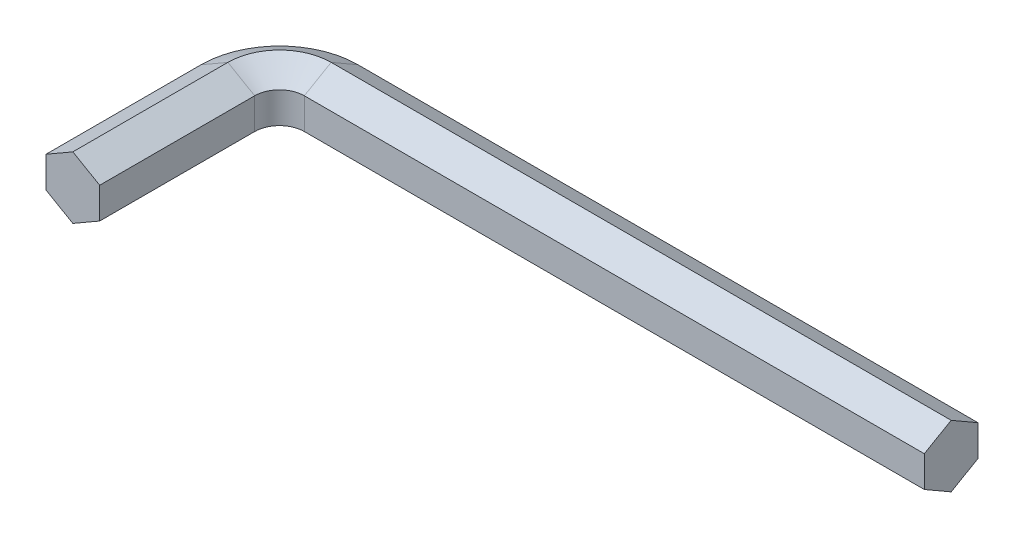
ISO-10303-21;
HEADER;
FILE_DESCRIPTION(('STEP AP214'),'2;1');
FILE_NAME('part.step','',(''),(''),'','','');
FILE_SCHEMA(('AUTOMOTIVE_DESIGN { 1 0 10303 214 1 1 1 1 }'));
ENDSEC;
DATA;
#1=APPLICATION_CONTEXT('core data for automotive mechanical design processes');
#2=APPLICATION_PROTOCOL_DEFINITION('international standard','automotive_design',2000,#1);
#3=PRODUCT_CONTEXT('',#1,'mechanical');
#4=PRODUCT('Part','Part','',(#3));
#5=PRODUCT_RELATED_PRODUCT_CATEGORY('part','',(#4));
#6=PRODUCT_DEFINITION_FORMATION('','',#4);
#7=PRODUCT_DEFINITION_CONTEXT('part definition',#1,'design');
#8=PRODUCT_DEFINITION('design','',#6,#7);
#9=PRODUCT_DEFINITION_SHAPE('','',#8);
#10=(LENGTH_UNIT() NAMED_UNIT(*) SI_UNIT(.MILLI.,.METRE.));
#11=(NAMED_UNIT(*) PLANE_ANGLE_UNIT() SI_UNIT($,.RADIAN.));
#12=(NAMED_UNIT(*) SI_UNIT($,.STERADIAN.) SOLID_ANGLE_UNIT());
#13=UNCERTAINTY_MEASURE_WITH_UNIT(LENGTH_MEASURE(1.E-05),#10,'distance_accuracy_value','');
#14=(GEOMETRIC_REPRESENTATION_CONTEXT(3) GLOBAL_UNCERTAINTY_ASSIGNED_CONTEXT((#13)) GLOBAL_UNIT_ASSIGNED_CONTEXT((#10,
#11,#12)) REPRESENTATION_CONTEXT('',''));
#15=CARTESIAN_POINT('',(0.,0.,0.));
#16=DIRECTION('',(0.,0.,1.));
#17=DIRECTION('',(1.,0.,0.));
#18=AXIS2_PLACEMENT_3D('',#15,#16,#17);
#19=CARTESIAN_POINT('',(-1.28205128205128,0.,11.7948717948718));
#20=DIRECTION('',(0.,0.,-1.));
#21=DIRECTION('',(-1.,0.,0.));
#22=AXIS2_PLACEMENT_3D('',#19,#20,#21);
#23=PLANE('',#22);
#24=DIRECTION('',(0.866025403784439,-0.5,0.));
#25=VECTOR('',#24,1.);
#26=CARTESIAN_POINT('',(-9.48717948717949,3.,11.7948717948718));
#27=LINE('',#26,#25);
#28=CARTESIAN_POINT('',(-9.48717948717949,3.,11.7948717948718));
#29=VERTEX_POINT('',#28);
#30=CARTESIAN_POINT('',(-6.88910327582617,1.5,11.7948717948718));
#31=VERTEX_POINT('',#30);
#32=EDGE_CURVE('E182',#29,#31,#27,.T.);
#33=ORIENTED_EDGE('',*,*,#32,.F.);
#34=DIRECTION('',(0.866025403784438,0.5,0.));
#35=VECTOR('',#34,1.);
#36=CARTESIAN_POINT('',(-12.0852556985328,1.5,11.7948717948718));
#37=LINE('',#36,#35);
#38=CARTESIAN_POINT('',(-12.0852556985328,1.5,11.7948717948718));
#39=VERTEX_POINT('',#38);
#40=EDGE_CURVE('E224',#39,#29,#37,.T.);
#41=ORIENTED_EDGE('',*,*,#40,.F.);
#42=DIRECTION('',(0.,1.,0.));
#43=VECTOR('',#42,1.);
#44=CARTESIAN_POINT('',(-12.0852556985328,-1.5,11.7948717948718));
#45=LINE('',#44,#43);
#46=CARTESIAN_POINT('',(-12.0852556985328,-1.5,11.7948717948718));
#47=VERTEX_POINT('',#46);
#48=EDGE_CURVE('E211',#47,#39,#45,.T.);
#49=ORIENTED_EDGE('',*,*,#48,.F.);
#50=DIRECTION('',(-0.866025403784439,0.5,0.));
#51=VECTOR('',#50,1.);
#52=CARTESIAN_POINT('',(-9.48717948717949,-3.,11.7948717948718));
#53=LINE('',#52,#51);
#54=CARTESIAN_POINT('',(-9.48717948717949,-3.,11.7948717948718));
#55=VERTEX_POINT('',#54);
#56=EDGE_CURVE('E134',#55,#47,#53,.T.);
#57=ORIENTED_EDGE('',*,*,#56,.F.);
#58=DIRECTION('',(-0.866025403784439,-0.5,0.));
#59=VECTOR('',#58,1.);
#60=CARTESIAN_POINT('',(-6.88910327582617,-1.5,11.7948717948718));
#61=LINE('',#60,#59);
#62=CARTESIAN_POINT('',(-6.88910327582617,-1.5,11.7948717948718));
#63=VERTEX_POINT('',#62);
#64=EDGE_CURVE('E138',#63,#55,#61,.T.);
#65=ORIENTED_EDGE('',*,*,#64,.F.);
#66=DIRECTION('',(0.,-1.,0.));
#67=VECTOR('',#66,1.);
#68=CARTESIAN_POINT('',(-6.88910327582617,1.5,11.7948717948718));
#69=LINE('',#68,#67);
#70=EDGE_CURVE('E143',#31,#63,#69,.T.);
#71=ORIENTED_EDGE('',*,*,#70,.F.);
#72=EDGE_LOOP('',(#33,#41,#49,#57,#65,#71));
#73=FACE_BOUND('',#72,.T.);
#74=ADVANCED_FACE('F33',(#73),#23,.F.);
#75=CARTESIAN_POINT('',(55.5128205128205,0.,0.));
#76=DIRECTION('',(1.,0.,0.));
#77=DIRECTION('',(0.,0.,-1.));
#78=AXIS2_PLACEMENT_3D('',#75,#76,#77);
#79=PLANE('',#78);
#80=DIRECTION('',(0.,-0.5,0.866025403784439));
#81=VECTOR('',#80,1.);
#82=CARTESIAN_POINT('',(55.5128205128205,3.,-8.2051282051282));
#83=LINE('',#82,#81);
#84=CARTESIAN_POINT('',(55.5128205128205,3.,-8.2051282051282));
#85=VERTEX_POINT('',#84);
#86=CARTESIAN_POINT('',(55.5128205128205,1.5,-5.60705199377489));
#87=VERTEX_POINT('',#86);
#88=EDGE_CURVE('E154',#85,#87,#83,.T.);
#89=ORIENTED_EDGE('',*,*,#88,.T.);
#90=DIRECTION('',(0.,-1.,0.));
#91=VECTOR('',#90,1.);
#92=CARTESIAN_POINT('',(55.5128205128205,1.5,-5.60705199377489));
#93=LINE('',#92,#91);
#94=CARTESIAN_POINT('',(55.5128205128205,-1.5,-5.60705199377489));
#95=VERTEX_POINT('',#94);
#96=EDGE_CURVE('E157',#87,#95,#93,.T.);
#97=ORIENTED_EDGE('',*,*,#96,.T.);
#98=DIRECTION('',(0.,-0.5,-0.866025403784439));
#99=VECTOR('',#98,1.);
#100=CARTESIAN_POINT('',(55.5128205128205,-1.5,-5.60705199377489));
#101=LINE('',#100,#99);
#102=CARTESIAN_POINT('',(55.5128205128205,-3.,-8.20512820512821));
#103=VERTEX_POINT('',#102);
#104=EDGE_CURVE('E197',#95,#103,#101,.T.);
#105=ORIENTED_EDGE('',*,*,#104,.T.);
#106=DIRECTION('',(0.,0.5,-0.866025403784439));
#107=VECTOR('',#106,1.);
#108=CARTESIAN_POINT('',(55.5128205128205,-3.,-8.20512820512821));
#109=LINE('',#108,#107);
#110=CARTESIAN_POINT('',(55.5128205128205,-1.5,-10.8032044164815));
#111=VERTEX_POINT('',#110);
#112=EDGE_CURVE('E52',#103,#111,#109,.T.);
#113=ORIENTED_EDGE('',*,*,#112,.T.);
#114=DIRECTION('',(0.,1.,0.));
#115=VECTOR('',#114,1.);
#116=CARTESIAN_POINT('',(55.5128205128205,-1.5,-10.8032044164815));
#117=LINE('',#116,#115);
#118=CARTESIAN_POINT('',(55.5128205128205,1.5,-10.8032044164815));
#119=VERTEX_POINT('',#118);
#120=EDGE_CURVE('E46',#111,#119,#117,.T.);
#121=ORIENTED_EDGE('',*,*,#120,.T.);
#122=DIRECTION('',(0.,0.5,0.866025403784438));
#123=VECTOR('',#122,1.);
#124=CARTESIAN_POINT('',(55.5128205128205,1.5,-10.8032044164815));
#125=LINE('',#124,#123);
#126=EDGE_CURVE('E11',#119,#85,#125,.T.);
#127=ORIENTED_EDGE('',*,*,#126,.T.);
#128=EDGE_LOOP('',(#89,#97,#105,#113,#121,#127));
#129=FACE_BOUND('',#128,.T.);
#130=ADVANCED_FACE('F156',(#129),#79,.T.);
#131=CARTESIAN_POINT('',(-9.48717948717949,3.,11.7948717948718));
#132=DIRECTION('',(0.5,0.866025403784439,0.));
#133=DIRECTION('',(-0.866025403784439,0.5,0.));
#134=AXIS2_PLACEMENT_3D('',#131,#132,#133);
#135=PLANE('',#134);
#136=DIRECTION('',(0.,0.,-1.));
#137=VECTOR('',#136,1.);
#138=CARTESIAN_POINT('',(-6.88910327582617,1.5,11.7948717948718));
#139=LINE('',#138,#137);
#140=CARTESIAN_POINT('',(-6.88910327582617,1.5,-3.20512820512822));
#141=VERTEX_POINT('',#140);
#142=EDGE_CURVE('E187',#31,#141,#139,.T.);
#143=ORIENTED_EDGE('',*,*,#142,.T.);
#144=DIRECTION('',(0.866025403784439,-0.5,0.));
#145=VECTOR('',#144,1.);
#146=CARTESIAN_POINT('',(-9.48717948717949,3.,-3.20512820512822));
#147=LINE('',#146,#145);
#148=CARTESIAN_POINT('',(-9.48717948717949,3.,-3.20512820512822));
#149=VERTEX_POINT('',#148);
#150=EDGE_CURVE('E256',#149,#141,#147,.T.);
#151=ORIENTED_EDGE('',*,*,#150,.F.);
#152=DIRECTION('',(0.,0.,-1.));
#153=VECTOR('',#152,1.);
#154=CARTESIAN_POINT('',(-9.48717948717949,3.,11.7948717948718));
#155=LINE('',#154,#153);
#156=EDGE_CURVE('E238',#29,#149,#155,.T.);
#157=ORIENTED_EDGE('',*,*,#156,.F.);
#158=ORIENTED_EDGE('',*,*,#32,.T.);
#159=EDGE_LOOP('',(#143,#151,#157,#158));
#160=FACE_BOUND('',#159,.T.);
#161=ADVANCED_FACE('F263',(#160),#135,.T.);
#162=CARTESIAN_POINT('',(-6.88910327582617,1.5,11.7948717948718));
#163=DIRECTION('',(1.,0.,0.));
#164=DIRECTION('',(0.,0.,-1.));
#165=AXIS2_PLACEMENT_3D('',#162,#163,#164);
#166=PLANE('',#165);
#167=DIRECTION('',(0.,0.,-1.));
#168=VECTOR('',#167,1.);
#169=CARTESIAN_POINT('',(-6.88910327582617,-1.5,11.7948717948718));
#170=LINE('',#169,#168);
#171=CARTESIAN_POINT('',(-6.88910327582617,-1.5,-3.20512820512822));
#172=VERTEX_POINT('',#171);
#173=EDGE_CURVE('E186',#63,#172,#170,.T.);
#174=ORIENTED_EDGE('',*,*,#173,.T.);
#175=DIRECTION('',(0.,-1.,0.));
#176=VECTOR('',#175,1.);
#177=CARTESIAN_POINT('',(-6.88910327582617,1.5,-3.20512820512822));
#178=LINE('',#177,#176);
#179=EDGE_CURVE('E183',#141,#172,#178,.T.);
#180=ORIENTED_EDGE('',*,*,#179,.F.);
#181=ORIENTED_EDGE('',*,*,#142,.F.);
#182=ORIENTED_EDGE('',*,*,#70,.T.);
#183=EDGE_LOOP('',(#174,#180,#181,#182));
#184=FACE_BOUND('',#183,.T.);
#185=ADVANCED_FACE('F266',(#184),#166,.T.);
#186=CARTESIAN_POINT('',(-6.88910327582617,-1.5,11.7948717948718));
#187=DIRECTION('',(0.5,-0.866025403784439,0.));
#188=DIRECTION('',(0.866025403784439,0.5,0.));
#189=AXIS2_PLACEMENT_3D('',#186,#187,#188);
#190=PLANE('',#189);
#191=DIRECTION('',(0.,0.,-1.));
#192=VECTOR('',#191,1.);
#193=CARTESIAN_POINT('',(-9.48717948717949,-3.,11.7948717948718));
#194=LINE('',#193,#192);
#195=CARTESIAN_POINT('',(-9.48717948717949,-3.,-3.20512820512822));
#196=VERTEX_POINT('',#195);
#197=EDGE_CURVE('E200',#55,#196,#194,.T.);
#198=ORIENTED_EDGE('',*,*,#197,.T.);
#199=DIRECTION('',(-0.866025403784439,-0.5,0.));
#200=VECTOR('',#199,1.);
#201=CARTESIAN_POINT('',(-6.88910327582617,-1.5,-3.20512820512822));
#202=LINE('',#201,#200);
#203=EDGE_CURVE('E190',#172,#196,#202,.T.);
#204=ORIENTED_EDGE('',*,*,#203,.F.);
#205=ORIENTED_EDGE('',*,*,#173,.F.);
#206=ORIENTED_EDGE('',*,*,#64,.T.);
#207=EDGE_LOOP('',(#198,#204,#205,#206));
#208=FACE_BOUND('',#207,.T.);
#209=ADVANCED_FACE('F320',(#208),#190,.T.);
#210=CARTESIAN_POINT('',(-9.48717948717949,-3.,11.7948717948718));
#211=DIRECTION('',(-0.5,-0.866025403784439,0.));
#212=DIRECTION('',(0.866025403784439,-0.5,0.));
#213=AXIS2_PLACEMENT_3D('',#210,#211,#212);
#214=PLANE('',#213);
#215=DIRECTION('',(0.,0.,-1.));
#216=VECTOR('',#215,1.);
#217=CARTESIAN_POINT('',(-12.0852556985328,-1.5,11.7948717948718));
#218=LINE('',#217,#216);
#219=CARTESIAN_POINT('',(-12.0852556985328,-1.5,-3.20512820512822));
#220=VERTEX_POINT('',#219);
#221=EDGE_CURVE('E213',#47,#220,#218,.T.);
#222=ORIENTED_EDGE('',*,*,#221,.T.);
#223=DIRECTION('',(-0.866025403784439,0.5,0.));
#224=VECTOR('',#223,1.);
#225=CARTESIAN_POINT('',(-9.48717948717949,-3.,-3.20512820512822));
#226=LINE('',#225,#224);
#227=EDGE_CURVE('E203',#196,#220,#226,.T.);
#228=ORIENTED_EDGE('',*,*,#227,.F.);
#229=ORIENTED_EDGE('',*,*,#197,.F.);
#230=ORIENTED_EDGE('',*,*,#56,.T.);
#231=EDGE_LOOP('',(#222,#228,#229,#230));
#232=FACE_BOUND('',#231,.T.);
#233=ADVANCED_FACE('F328',(#232),#214,.T.);
#234=CARTESIAN_POINT('',(-12.0852556985328,-1.5,11.7948717948718));
#235=DIRECTION('',(-1.,0.,0.));
#236=DIRECTION('',(0.,0.,1.));
#237=AXIS2_PLACEMENT_3D('',#234,#235,#236);
#238=PLANE('',#237);
#239=DIRECTION('',(0.,0.,-1.));
#240=VECTOR('',#239,1.);
#241=CARTESIAN_POINT('',(-12.0852556985328,1.5,11.7948717948718));
#242=LINE('',#241,#240);
#243=CARTESIAN_POINT('',(-12.0852556985328,1.5,-3.20512820512822));
#244=VERTEX_POINT('',#243);
#245=EDGE_CURVE('E226',#39,#244,#242,.T.);
#246=ORIENTED_EDGE('',*,*,#245,.T.);
#247=DIRECTION('',(0.,1.,0.));
#248=VECTOR('',#247,1.);
#249=CARTESIAN_POINT('',(-12.0852556985328,-1.5,-3.20512820512822));
#250=LINE('',#249,#248);
#251=EDGE_CURVE('E216',#220,#244,#250,.T.);
#252=ORIENTED_EDGE('',*,*,#251,.F.);
#253=ORIENTED_EDGE('',*,*,#221,.F.);
#254=ORIENTED_EDGE('',*,*,#48,.T.);
#255=EDGE_LOOP('',(#246,#252,#253,#254));
#256=FACE_BOUND('',#255,.T.);
#257=ADVANCED_FACE('F338',(#256),#238,.T.);
#258=CARTESIAN_POINT('',(-12.0852556985328,1.5,11.7948717948718));
#259=DIRECTION('',(-0.5,0.866025403784439,0.));
#260=DIRECTION('',(-0.866025403784439,-0.5,0.));
#261=AXIS2_PLACEMENT_3D('',#258,#259,#260);
#262=PLANE('',#261);
#263=DIRECTION('',(0.866025403784438,0.5,0.));
#264=VECTOR('',#263,1.);
#265=CARTESIAN_POINT('',(-12.0852556985328,1.5,-3.20512820512822));
#266=LINE('',#265,#264);
#267=EDGE_CURVE('E229',#244,#149,#266,.T.);
#268=ORIENTED_EDGE('',*,*,#267,.F.);
#269=ORIENTED_EDGE('',*,*,#245,.F.);
#270=ORIENTED_EDGE('',*,*,#40,.T.);
#271=ORIENTED_EDGE('',*,*,#156,.T.);
#272=EDGE_LOOP('',(#268,#269,#270,#271));
#273=FACE_BOUND('',#272,.T.);
#274=ADVANCED_FACE('F279',(#273),#262,.T.);
#275=CARTESIAN_POINT('',(-4.48717948717949,3.,-3.20512820512821));
#276=DIRECTION('',(0.,1.,0.));
#277=DIRECTION('',(0.,0.,1.));
#278=AXIS2_PLACEMENT_3D('',#275,#276,#277);
#279=CONICAL_SURFACE('',#278,5.,1.0471975511966);
#280=CARTESIAN_POINT('',(-4.48717948717949,1.5,-3.20512820512821));
#281=DIRECTION('',(0.,-1.,0.));
#282=DIRECTION('',(-1.,0.,0.));
#283=AXIS2_PLACEMENT_3D('',#280,#281,#282);
#284=CIRCLE('',#283,2.40192378864668);
#285=CARTESIAN_POINT('',(-4.48717948717948,1.5,-5.60705199377489));
#286=VERTEX_POINT('',#285);
#287=EDGE_CURVE('E193',#141,#286,#284,.T.);
#288=ORIENTED_EDGE('',*,*,#287,.T.);
#289=DIRECTION('',(0.,-0.5,0.866025403784439));
#290=VECTOR('',#289,1.);
#291=CARTESIAN_POINT('',(-4.48717948717948,3.,-8.2051282051282));
#292=LINE('',#291,#290);
#293=CARTESIAN_POINT('',(-4.48717948717948,3.,-8.2051282051282));
#294=VERTEX_POINT('',#293);
#295=EDGE_CURVE('E175',#294,#286,#292,.T.);
#296=ORIENTED_EDGE('',*,*,#295,.F.);
#297=CARTESIAN_POINT('',(-4.48717948717949,3.,-3.20512820512821));
#298=DIRECTION('',(0.,-1.,0.));
#299=DIRECTION('',(-1.,0.,0.));
#300=AXIS2_PLACEMENT_3D('',#297,#298,#299);
#301=CIRCLE('',#300,5.);
#302=EDGE_CURVE('E240',#149,#294,#301,.T.);
#303=ORIENTED_EDGE('',*,*,#302,.F.);
#304=ORIENTED_EDGE('',*,*,#150,.T.);
#305=EDGE_LOOP('',(#288,#296,#303,#304));
#306=FACE_BOUND('',#305,.T.);
#307=ADVANCED_FACE('F246',(#306),#279,.F.);
#308=CARTESIAN_POINT('',(-4.48717948717949,0.,-3.20512820512821));
#309=DIRECTION('',(0.,-1.,0.));
#310=DIRECTION('',(0.,0.,-1.));
#311=AXIS2_PLACEMENT_3D('',#308,#309,#310);
#312=CYLINDRICAL_SURFACE('',#311,2.40192378864668);
#313=CARTESIAN_POINT('',(-4.48717948717949,-1.5,-3.20512820512821));
#314=DIRECTION('',(0.,-1.,0.));
#315=DIRECTION('',(-1.,0.,0.));
#316=AXIS2_PLACEMENT_3D('',#313,#314,#315);
#317=CIRCLE('',#316,2.40192378864668);
#318=CARTESIAN_POINT('',(-4.48717948717948,-1.5,-5.60705199377489));
#319=VERTEX_POINT('',#318);
#320=EDGE_CURVE('E121',#172,#319,#317,.T.);
#321=ORIENTED_EDGE('',*,*,#320,.T.);
#322=DIRECTION('',(0.,-1.,0.));
#323=VECTOR('',#322,1.);
#324=CARTESIAN_POINT('',(-4.48717948717948,1.5,-5.60705199377489));
#325=LINE('',#324,#323);
#326=EDGE_CURVE('E191',#286,#319,#325,.T.);
#327=ORIENTED_EDGE('',*,*,#326,.F.);
#328=ORIENTED_EDGE('',*,*,#287,.F.);
#329=ORIENTED_EDGE('',*,*,#179,.T.);
#330=EDGE_LOOP('',(#321,#327,#328,#329));
#331=FACE_BOUND('',#330,.T.);
#332=ADVANCED_FACE('F269',(#331),#312,.F.);
#333=CARTESIAN_POINT('',(-4.48717948717949,-1.5,-3.20512820512821));
#334=DIRECTION('',(0.,-1.,0.));
#335=DIRECTION('',(0.,0.,-1.));
#336=AXIS2_PLACEMENT_3D('',#333,#334,#335);
#337=CONICAL_SURFACE('',#336,2.40192378864668,1.0471975511966);
#338=CARTESIAN_POINT('',(-4.48717948717949,-3.,-3.20512820512821));
#339=DIRECTION('',(0.,-1.,0.));
#340=DIRECTION('',(-1.,0.,0.));
#341=AXIS2_PLACEMENT_3D('',#338,#339,#340);
#342=CIRCLE('',#341,5.);
#343=CARTESIAN_POINT('',(-4.48717948717948,-3.,-8.20512820512821));
#344=VERTEX_POINT('',#343);
#345=EDGE_CURVE('E112',#196,#344,#342,.T.);
#346=ORIENTED_EDGE('',*,*,#345,.T.);
#347=DIRECTION('',(0.,-0.5,-0.866025403784439));
#348=VECTOR('',#347,1.);
#349=CARTESIAN_POINT('',(-4.48717948717948,-1.5,-5.60705199377489));
#350=LINE('',#349,#348);
#351=EDGE_CURVE('E194',#319,#344,#350,.T.);
#352=ORIENTED_EDGE('',*,*,#351,.F.);
#353=ORIENTED_EDGE('',*,*,#320,.F.);
#354=ORIENTED_EDGE('',*,*,#203,.T.);
#355=EDGE_LOOP('',(#346,#352,#353,#354));
#356=FACE_BOUND('',#355,.T.);
#357=ADVANCED_FACE('F271',(#356),#337,.F.);
#358=CARTESIAN_POINT('',(-4.48717948717949,-3.,-3.20512820512821));
#359=DIRECTION('',(0.,1.,0.));
#360=DIRECTION('',(0.,0.,1.));
#361=AXIS2_PLACEMENT_3D('',#358,#359,#360);
#362=CONICAL_SURFACE('',#361,5.,1.0471975511966);
#363=CARTESIAN_POINT('',(-4.48717948717949,-1.5,-3.20512820512821));
#364=DIRECTION('',(0.,-1.,0.));
#365=DIRECTION('',(-1.,0.,0.));
#366=AXIS2_PLACEMENT_3D('',#363,#364,#365);
#367=CIRCLE('',#366,7.59807621135332);
#368=CARTESIAN_POINT('',(-4.48717948717948,-1.5,-10.8032044164815));
#369=VERTEX_POINT('',#368);
#370=EDGE_CURVE('E105',#220,#369,#367,.T.);
#371=ORIENTED_EDGE('',*,*,#370,.T.);
#372=DIRECTION('',(0.,0.5,-0.866025403784439));
#373=VECTOR('',#372,1.);
#374=CARTESIAN_POINT('',(-4.48717948717948,-3.,-8.20512820512821));
#375=LINE('',#374,#373);
#376=EDGE_CURVE('E207',#344,#369,#375,.T.);
#377=ORIENTED_EDGE('',*,*,#376,.F.);
#378=ORIENTED_EDGE('',*,*,#345,.F.);
#379=ORIENTED_EDGE('',*,*,#227,.T.);
#380=EDGE_LOOP('',(#371,#377,#378,#379));
#381=FACE_BOUND('',#380,.T.);
#382=ADVANCED_FACE('F277',(#381),#362,.T.);
#383=CARTESIAN_POINT('',(-4.48717948717949,0.,-3.20512820512821));
#384=DIRECTION('',(0.,-1.,0.));
#385=DIRECTION('',(0.,0.,-1.));
#386=AXIS2_PLACEMENT_3D('',#383,#384,#385);
#387=CYLINDRICAL_SURFACE('',#386,7.59807621135332);
#388=CARTESIAN_POINT('',(-4.48717948717949,1.5,-3.20512820512821));
#389=DIRECTION('',(0.,-1.,0.));
#390=DIRECTION('',(-1.,0.,0.));
#391=AXIS2_PLACEMENT_3D('',#388,#389,#390);
#392=CIRCLE('',#391,7.59807621135332);
#393=CARTESIAN_POINT('',(-4.48717948717948,1.5,-10.8032044164815));
#394=VERTEX_POINT('',#393);
#395=EDGE_CURVE('E231',#244,#394,#392,.T.);
#396=ORIENTED_EDGE('',*,*,#395,.T.);
#397=DIRECTION('',(0.,1.,0.));
#398=VECTOR('',#397,1.);
#399=CARTESIAN_POINT('',(-4.48717948717948,-1.5,-10.8032044164815));
#400=LINE('',#399,#398);
#401=EDGE_CURVE('E219',#369,#394,#400,.T.);
#402=ORIENTED_EDGE('',*,*,#401,.F.);
#403=ORIENTED_EDGE('',*,*,#370,.F.);
#404=ORIENTED_EDGE('',*,*,#251,.T.);
#405=EDGE_LOOP('',(#396,#402,#403,#404));
#406=FACE_BOUND('',#405,.T.);
#407=ADVANCED_FACE('F381',(#406),#387,.T.);
#408=CARTESIAN_POINT('',(-4.48717948717949,1.5,-3.20512820512821));
#409=DIRECTION('',(0.,-1.,0.));
#410=DIRECTION('',(0.,0.,-1.));
#411=AXIS2_PLACEMENT_3D('',#408,#409,#410);
#412=CONICAL_SURFACE('',#411,7.59807621135332,1.0471975511966);
#413=DIRECTION('',(0.,0.5,0.866025403784438));
#414=VECTOR('',#413,1.);
#415=CARTESIAN_POINT('',(-4.48717948717948,1.5,-10.8032044164815));
#416=LINE('',#415,#414);
#417=EDGE_CURVE('E180',#394,#294,#416,.T.);
#418=ORIENTED_EDGE('',*,*,#417,.F.);
#419=ORIENTED_EDGE('',*,*,#395,.F.);
#420=ORIENTED_EDGE('',*,*,#267,.T.);
#421=ORIENTED_EDGE('',*,*,#302,.T.);
#422=EDGE_LOOP('',(#418,#419,#420,#421));
#423=FACE_BOUND('',#422,.T.);
#424=ADVANCED_FACE('F249',(#423),#412,.T.);
#425=CARTESIAN_POINT('',(-4.48717948717948,3.,-8.2051282051282));
#426=DIRECTION('',(0.,0.866025403784439,0.5));
#427=DIRECTION('',(0.,-0.5,0.866025403784439));
#428=AXIS2_PLACEMENT_3D('',#425,#426,#427);
#429=PLANE('',#428);
#430=DIRECTION('',(1.,0.,0.));
#431=VECTOR('',#430,1.);
#432=CARTESIAN_POINT('',(-4.48717948717948,1.5,-5.60705199377489));
#433=LINE('',#432,#431);
#434=EDGE_CURVE('E162',#286,#87,#433,.T.);
#435=ORIENTED_EDGE('',*,*,#434,.T.);
#436=ORIENTED_EDGE('',*,*,#88,.F.);
#437=DIRECTION('',(1.,0.,0.));
#438=VECTOR('',#437,1.);
#439=CARTESIAN_POINT('',(-4.48717948717948,3.,-8.2051282051282));
#440=LINE('',#439,#438);
#441=EDGE_CURVE('E163',#294,#85,#440,.T.);
#442=ORIENTED_EDGE('',*,*,#441,.F.);
#443=ORIENTED_EDGE('',*,*,#295,.T.);
#444=EDGE_LOOP('',(#435,#436,#442,#443));
#445=FACE_BOUND('',#444,.T.);
#446=ADVANCED_FACE('F173',(#445),#429,.T.);
#447=CARTESIAN_POINT('',(-4.48717948717948,1.5,-5.60705199377489));
#448=DIRECTION('',(0.,0.,1.));
#449=DIRECTION('',(1.,0.,0.));
#450=AXIS2_PLACEMENT_3D('',#447,#448,#449);
#451=PLANE('',#450);
#452=DIRECTION('',(1.,0.,0.));
#453=VECTOR('',#452,1.);
#454=CARTESIAN_POINT('',(-4.48717948717948,-1.5,-5.60705199377489));
#455=LINE('',#454,#453);
#456=EDGE_CURVE('E170',#319,#95,#455,.T.);
#457=ORIENTED_EDGE('',*,*,#456,.T.);
#458=ORIENTED_EDGE('',*,*,#96,.F.);
#459=ORIENTED_EDGE('',*,*,#434,.F.);
#460=ORIENTED_EDGE('',*,*,#326,.T.);
#461=EDGE_LOOP('',(#457,#458,#459,#460));
#462=FACE_BOUND('',#461,.T.);
#463=ADVANCED_FACE('F167',(#462),#451,.T.);
#464=CARTESIAN_POINT('',(-4.48717948717948,-1.5,-5.60705199377489));
#465=DIRECTION('',(0.,-0.866025403784439,0.5));
#466=DIRECTION('',(0.,-0.5,-0.866025403784439));
#467=AXIS2_PLACEMENT_3D('',#464,#465,#466);
#468=PLANE('',#467);
#469=DIRECTION('',(1.,0.,0.));
#470=VECTOR('',#469,1.);
#471=CARTESIAN_POINT('',(-4.48717948717948,-3.,-8.20512820512821));
#472=LINE('',#471,#470);
#473=EDGE_CURVE('E90',#344,#103,#472,.T.);
#474=ORIENTED_EDGE('',*,*,#473,.T.);
#475=ORIENTED_EDGE('',*,*,#104,.F.);
#476=ORIENTED_EDGE('',*,*,#456,.F.);
#477=ORIENTED_EDGE('',*,*,#351,.T.);
#478=EDGE_LOOP('',(#474,#475,#476,#477));
#479=FACE_BOUND('',#478,.T.);
#480=ADVANCED_FACE('F413',(#479),#468,.T.);
#481=CARTESIAN_POINT('',(-4.48717948717948,-3.,-8.20512820512821));
#482=DIRECTION('',(0.,-0.866025403784439,-0.5));
#483=DIRECTION('',(0.,0.5,-0.866025403784439));
#484=AXIS2_PLACEMENT_3D('',#481,#482,#483);
#485=PLANE('',#484);
#486=DIRECTION('',(1.,0.,0.));
#487=VECTOR('',#486,1.);
#488=CARTESIAN_POINT('',(-4.48717948717948,-1.5,-10.8032044164815));
#489=LINE('',#488,#487);
#490=EDGE_CURVE('E82',#369,#111,#489,.T.);
#491=ORIENTED_EDGE('',*,*,#490,.T.);
#492=ORIENTED_EDGE('',*,*,#112,.F.);
#493=ORIENTED_EDGE('',*,*,#473,.F.);
#494=ORIENTED_EDGE('',*,*,#376,.T.);
#495=EDGE_LOOP('',(#491,#492,#493,#494));
#496=FACE_BOUND('',#495,.T.);
#497=ADVANCED_FACE('F289',(#496),#485,.T.);
#498=CARTESIAN_POINT('',(-4.48717948717948,-1.5,-10.8032044164815));
#499=DIRECTION('',(0.,0.,-1.));
#500=DIRECTION('',(-1.,0.,0.));
#501=AXIS2_PLACEMENT_3D('',#498,#499,#500);
#502=PLANE('',#501);
#503=DIRECTION('',(1.,0.,0.));
#504=VECTOR('',#503,1.);
#505=CARTESIAN_POINT('',(-4.48717948717948,1.5,-10.8032044164815));
#506=LINE('',#505,#504);
#507=EDGE_CURVE('E40',#394,#119,#506,.T.);
#508=ORIENTED_EDGE('',*,*,#507,.T.);
#509=ORIENTED_EDGE('',*,*,#120,.F.);
#510=ORIENTED_EDGE('',*,*,#490,.F.);
#511=ORIENTED_EDGE('',*,*,#401,.T.);
#512=EDGE_LOOP('',(#508,#509,#510,#511));
#513=FACE_BOUND('',#512,.T.);
#514=ADVANCED_FACE('F284',(#513),#502,.T.);
#515=CARTESIAN_POINT('',(-4.48717948717948,1.5,-10.8032044164815));
#516=DIRECTION('',(0.,0.866025403784439,-0.5));
#517=DIRECTION('',(0.,0.5,0.866025403784439));
#518=AXIS2_PLACEMENT_3D('',#515,#516,#517);
#519=PLANE('',#518);
#520=ORIENTED_EDGE('',*,*,#126,.F.);
#521=ORIENTED_EDGE('',*,*,#507,.F.);
#522=ORIENTED_EDGE('',*,*,#417,.T.);
#523=ORIENTED_EDGE('',*,*,#441,.T.);
#524=EDGE_LOOP('',(#520,#521,#522,#523));
#525=FACE_BOUND('',#524,.T.);
#526=ADVANCED_FACE('F241',(#525),#519,.T.);
#527=CLOSED_SHELL('',(#74,#130,#161,#185,#209,#233,#257,#274,#307,#332,#357,#382,#407,#424,#446,
#463,#480,#497,#514,#526));
#528=MANIFOLD_SOLID_BREP('B2',#527);
#529=ADVANCED_BREP_SHAPE_REPRESENTATION('',(#18,#528),#14);
#530=SHAPE_DEFINITION_REPRESENTATION(#9,#529);
ENDSEC;
END-ISO-10303-21;
